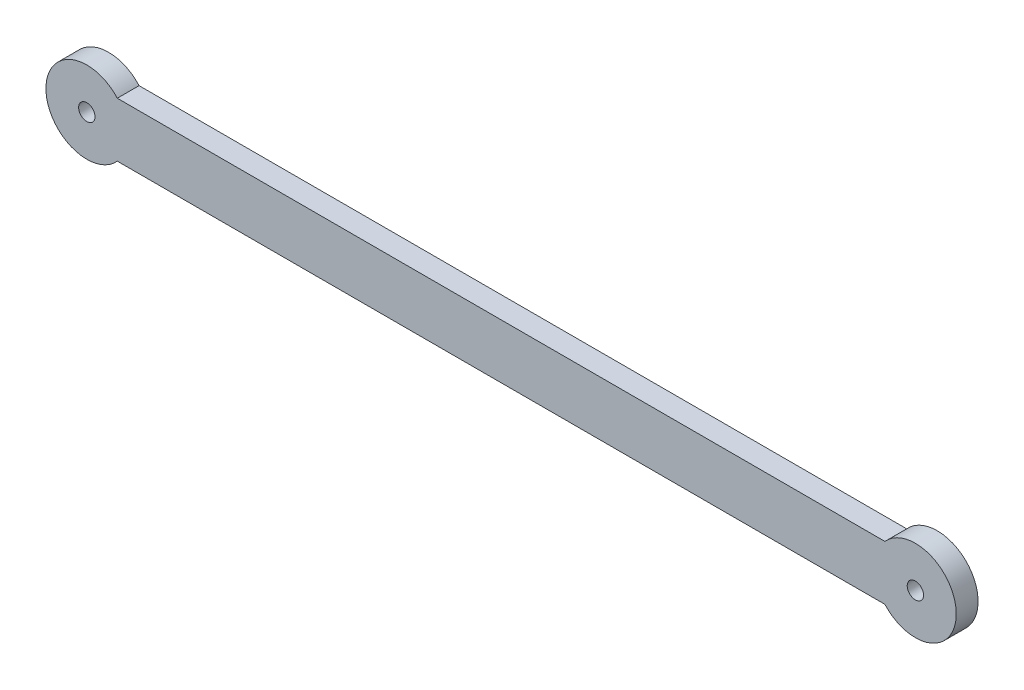
ISO-10303-21;
HEADER;
FILE_DESCRIPTION(('STEP AP214'),'2;1');
FILE_NAME('part.step','',(''),(''),'','','');
FILE_SCHEMA(('AUTOMOTIVE_DESIGN { 1 0 10303 214 1 1 1 1 }'));
ENDSEC;
DATA;
#1=APPLICATION_CONTEXT('core data for automotive mechanical design processes');
#2=APPLICATION_PROTOCOL_DEFINITION('international standard','automotive_design',2000,#1);
#3=PRODUCT_CONTEXT('',#1,'mechanical');
#4=PRODUCT('Part','Part','',(#3));
#5=PRODUCT_RELATED_PRODUCT_CATEGORY('part','',(#4));
#6=PRODUCT_DEFINITION_FORMATION('','',#4);
#7=PRODUCT_DEFINITION_CONTEXT('part definition',#1,'design');
#8=PRODUCT_DEFINITION('design','',#6,#7);
#9=PRODUCT_DEFINITION_SHAPE('','',#8);
#10=(LENGTH_UNIT() NAMED_UNIT(*) SI_UNIT(.MILLI.,.METRE.));
#11=(NAMED_UNIT(*) PLANE_ANGLE_UNIT() SI_UNIT($,.RADIAN.));
#12=(NAMED_UNIT(*) SI_UNIT($,.STERADIAN.) SOLID_ANGLE_UNIT());
#13=UNCERTAINTY_MEASURE_WITH_UNIT(LENGTH_MEASURE(1.E-05),#10,'distance_accuracy_value','');
#14=(GEOMETRIC_REPRESENTATION_CONTEXT(3) GLOBAL_UNCERTAINTY_ASSIGNED_CONTEXT((#13)) GLOBAL_UNIT_ASSIGNED_CONTEXT((#10,
#11,#12)) REPRESENTATION_CONTEXT('',''));
#15=CARTESIAN_POINT('',(0.,0.,0.));
#16=DIRECTION('',(0.,0.,1.));
#17=DIRECTION('',(1.,0.,0.));
#18=AXIS2_PLACEMENT_3D('',#15,#16,#17);
#19=CARTESIAN_POINT('',(0.,0.,4.));
#20=DIRECTION('',(0.,0.,1.));
#21=DIRECTION('',(1.,0.,0.));
#22=AXIS2_PLACEMENT_3D('',#19,#20,#21);
#23=PLANE('',#22);
#24=CARTESIAN_POINT('',(0.,0.,4.));
#25=DIRECTION('',(0.,0.,1.));
#26=DIRECTION('',(1.,0.,0.));
#27=AXIS2_PLACEMENT_3D('',#24,#25,#26);
#28=CIRCLE('',#27,1.5);
#29=CARTESIAN_POINT('',(1.5,0.,4.));
#30=VERTEX_POINT('',#29);
#31=EDGE_CURVE('E108',#30,#30,#28,.T.);
#32=ORIENTED_EDGE('',*,*,#31,.F.);
#33=EDGE_LOOP('',(#32));
#34=FACE_BOUND('',#33,.T.);
#35=CARTESIAN_POINT('',(0.,0.,4.));
#36=DIRECTION('',(0.,0.,1.));
#37=DIRECTION('',(1.,0.,0.));
#38=AXIS2_PLACEMENT_3D('',#35,#36,#37);
#39=CIRCLE('',#38,7.5);
#40=CARTESIAN_POINT('',(5.59016994374947,5.,4.));
#41=VERTEX_POINT('',#40);
#42=CARTESIAN_POINT('',(5.59016994374947,-5.,4.));
#43=VERTEX_POINT('',#42);
#44=EDGE_CURVE('E93',#41,#43,#39,.T.);
#45=ORIENTED_EDGE('',*,*,#44,.T.);
#46=DIRECTION('',(1.,0.,0.));
#47=VECTOR('',#46,1.);
#48=CARTESIAN_POINT('',(5.59016994374947,-5.,4.));
#49=LINE('',#48,#47);
#50=CARTESIAN_POINT('',(146.409830056251,-5.,4.));
#51=VERTEX_POINT('',#50);
#52=EDGE_CURVE('E88',#43,#51,#49,.T.);
#53=ORIENTED_EDGE('',*,*,#52,.T.);
#54=CARTESIAN_POINT('',(152.,0.,4.));
#55=DIRECTION('',(0.,0.,1.));
#56=DIRECTION('',(1.,0.,0.));
#57=AXIS2_PLACEMENT_3D('',#54,#55,#56);
#58=CIRCLE('',#57,7.5);
#59=CARTESIAN_POINT('',(146.409830056251,5.,4.));
#60=VERTEX_POINT('',#59);
#61=EDGE_CURVE('E91',#51,#60,#58,.T.);
#62=ORIENTED_EDGE('',*,*,#61,.T.);
#63=DIRECTION('',(-1.,0.,0.));
#64=VECTOR('',#63,1.);
#65=CARTESIAN_POINT('',(5.59016994374947,5.,4.));
#66=LINE('',#65,#64);
#67=EDGE_CURVE('E58',#60,#41,#66,.T.);
#68=ORIENTED_EDGE('',*,*,#67,.T.);
#69=EDGE_LOOP('',(#45,#53,#62,#68));
#70=FACE_BOUND('',#69,.T.);
#71=CARTESIAN_POINT('',(152.,0.,4.));
#72=DIRECTION('',(0.,0.,1.));
#73=DIRECTION('',(1.,0.,0.));
#74=AXIS2_PLACEMENT_3D('',#71,#72,#73);
#75=CIRCLE('',#74,1.5);
#76=CARTESIAN_POINT('',(153.5,0.,4.));
#77=VERTEX_POINT('',#76);
#78=EDGE_CURVE('E123',#77,#77,#75,.T.);
#79=ORIENTED_EDGE('',*,*,#78,.F.);
#80=EDGE_LOOP('',(#79));
#81=FACE_BOUND('',#80,.T.);
#82=ADVANCED_FACE('F41',(#34,#70,#81),#23,.T.);
#83=CARTESIAN_POINT('',(0.,0.,0.));
#84=DIRECTION('',(0.,0.,1.));
#85=DIRECTION('',(1.,0.,0.));
#86=AXIS2_PLACEMENT_3D('',#83,#84,#85);
#87=PLANE('',#86);
#88=CARTESIAN_POINT('',(0.,0.,0.));
#89=DIRECTION('',(0.,0.,1.));
#90=DIRECTION('',(1.,0.,0.));
#91=AXIS2_PLACEMENT_3D('',#88,#89,#90);
#92=CIRCLE('',#91,1.5);
#93=CARTESIAN_POINT('',(1.5,0.,0.));
#94=VERTEX_POINT('',#93);
#95=EDGE_CURVE('E120',#94,#94,#92,.T.);
#96=ORIENTED_EDGE('',*,*,#95,.T.);
#97=EDGE_LOOP('',(#96));
#98=FACE_BOUND('',#97,.T.);
#99=CARTESIAN_POINT('',(0.,0.,0.));
#100=DIRECTION('',(0.,0.,1.));
#101=DIRECTION('',(1.,0.,0.));
#102=AXIS2_PLACEMENT_3D('',#99,#100,#101);
#103=CIRCLE('',#102,7.5);
#104=CARTESIAN_POINT('',(5.59016994374947,5.,0.));
#105=VERTEX_POINT('',#104);
#106=CARTESIAN_POINT('',(5.59016994374947,-5.,0.));
#107=VERTEX_POINT('',#106);
#108=EDGE_CURVE('E105',#105,#107,#103,.T.);
#109=ORIENTED_EDGE('',*,*,#108,.F.);
#110=DIRECTION('',(-1.,0.,0.));
#111=VECTOR('',#110,1.);
#112=CARTESIAN_POINT('',(5.59016994374947,5.,0.));
#113=LINE('',#112,#111);
#114=CARTESIAN_POINT('',(146.409830056251,5.,0.));
#115=VERTEX_POINT('',#114);
#116=EDGE_CURVE('E81',#115,#105,#113,.T.);
#117=ORIENTED_EDGE('',*,*,#116,.F.);
#118=CARTESIAN_POINT('',(152.,0.,0.));
#119=DIRECTION('',(0.,0.,1.));
#120=DIRECTION('',(1.,0.,0.));
#121=AXIS2_PLACEMENT_3D('',#118,#119,#120);
#122=CIRCLE('',#121,7.5);
#123=CARTESIAN_POINT('',(146.409830056251,-5.,0.));
#124=VERTEX_POINT('',#123);
#125=EDGE_CURVE('E75',#124,#115,#122,.T.);
#126=ORIENTED_EDGE('',*,*,#125,.F.);
#127=DIRECTION('',(1.,0.,0.));
#128=VECTOR('',#127,1.);
#129=CARTESIAN_POINT('',(5.59016994374947,-5.,0.));
#130=LINE('',#129,#128);
#131=EDGE_CURVE('E97',#107,#124,#130,.T.);
#132=ORIENTED_EDGE('',*,*,#131,.F.);
#133=EDGE_LOOP('',(#109,#117,#126,#132));
#134=FACE_BOUND('',#133,.T.);
#135=CARTESIAN_POINT('',(152.,0.,0.));
#136=DIRECTION('',(0.,0.,1.));
#137=DIRECTION('',(1.,0.,0.));
#138=AXIS2_PLACEMENT_3D('',#135,#136,#137);
#139=CIRCLE('',#138,1.5);
#140=CARTESIAN_POINT('',(153.5,0.,0.));
#141=VERTEX_POINT('',#140);
#142=EDGE_CURVE('E126',#141,#141,#139,.T.);
#143=ORIENTED_EDGE('',*,*,#142,.T.);
#144=EDGE_LOOP('',(#143));
#145=FACE_BOUND('',#144,.T.);
#146=ADVANCED_FACE('F116',(#98,#134,#145),#87,.F.);
#147=CARTESIAN_POINT('',(0.,0.,4.));
#148=DIRECTION('',(0.,0.,-1.));
#149=DIRECTION('',(-1.,0.,0.));
#150=AXIS2_PLACEMENT_3D('',#147,#148,#149);
#151=CYLINDRICAL_SURFACE('',#150,7.5);
#152=ORIENTED_EDGE('',*,*,#108,.T.);
#153=DIRECTION('',(0.,0.,-1.));
#154=VECTOR('',#153,1.);
#155=CARTESIAN_POINT('',(5.59016994374947,-5.,4.));
#156=LINE('',#155,#154);
#157=EDGE_CURVE('E13',#43,#107,#156,.T.);
#158=ORIENTED_EDGE('',*,*,#157,.F.);
#159=ORIENTED_EDGE('',*,*,#44,.F.);
#160=DIRECTION('',(0.,0.,-1.));
#161=VECTOR('',#160,1.);
#162=CARTESIAN_POINT('',(5.59016994374947,5.,4.));
#163=LINE('',#162,#161);
#164=EDGE_CURVE('E101',#41,#105,#163,.T.);
#165=ORIENTED_EDGE('',*,*,#164,.T.);
#166=EDGE_LOOP('',(#152,#158,#159,#165));
#167=FACE_BOUND('',#166,.T.);
#168=ADVANCED_FACE('F43',(#167),#151,.T.);
#169=CARTESIAN_POINT('',(5.59016994374947,-5.,4.));
#170=DIRECTION('',(0.,1.,0.));
#171=DIRECTION('',(0.,0.,1.));
#172=AXIS2_PLACEMENT_3D('',#169,#170,#171);
#173=PLANE('',#172);
#174=ORIENTED_EDGE('',*,*,#131,.T.);
#175=DIRECTION('',(0.,0.,-1.));
#176=VECTOR('',#175,1.);
#177=CARTESIAN_POINT('',(146.409830056251,-5.,4.));
#178=LINE('',#177,#176);
#179=EDGE_CURVE('E50',#51,#124,#178,.T.);
#180=ORIENTED_EDGE('',*,*,#179,.F.);
#181=ORIENTED_EDGE('',*,*,#52,.F.);
#182=ORIENTED_EDGE('',*,*,#157,.T.);
#183=EDGE_LOOP('',(#174,#180,#181,#182));
#184=FACE_BOUND('',#183,.T.);
#185=ADVANCED_FACE('F96',(#184),#173,.F.);
#186=CARTESIAN_POINT('',(152.,0.,4.));
#187=DIRECTION('',(0.,0.,-1.));
#188=DIRECTION('',(-1.,0.,0.));
#189=AXIS2_PLACEMENT_3D('',#186,#187,#188);
#190=CYLINDRICAL_SURFACE('',#189,7.5);
#191=ORIENTED_EDGE('',*,*,#125,.T.);
#192=DIRECTION('',(0.,0.,-1.));
#193=VECTOR('',#192,1.);
#194=CARTESIAN_POINT('',(146.409830056251,5.,4.));
#195=LINE('',#194,#193);
#196=EDGE_CURVE('E98',#60,#115,#195,.T.);
#197=ORIENTED_EDGE('',*,*,#196,.F.);
#198=ORIENTED_EDGE('',*,*,#61,.F.);
#199=ORIENTED_EDGE('',*,*,#179,.T.);
#200=EDGE_LOOP('',(#191,#197,#198,#199));
#201=FACE_BOUND('',#200,.T.);
#202=ADVANCED_FACE('F99',(#201),#190,.T.);
#203=CARTESIAN_POINT('',(5.59016994374947,5.,4.));
#204=DIRECTION('',(0.,-1.,0.));
#205=DIRECTION('',(0.,0.,-1.));
#206=AXIS2_PLACEMENT_3D('',#203,#204,#205);
#207=PLANE('',#206);
#208=ORIENTED_EDGE('',*,*,#116,.T.);
#209=ORIENTED_EDGE('',*,*,#164,.F.);
#210=ORIENTED_EDGE('',*,*,#67,.F.);
#211=ORIENTED_EDGE('',*,*,#196,.T.);
#212=EDGE_LOOP('',(#208,#209,#210,#211));
#213=FACE_BOUND('',#212,.T.);
#214=ADVANCED_FACE('F113',(#213),#207,.F.);
#215=CARTESIAN_POINT('',(0.,0.,4.));
#216=DIRECTION('',(0.,0.,-1.));
#217=DIRECTION('',(-1.,0.,0.));
#218=AXIS2_PLACEMENT_3D('',#215,#216,#217);
#219=CYLINDRICAL_SURFACE('',#218,1.5);
#220=ORIENTED_EDGE('',*,*,#31,.T.);
#221=EDGE_LOOP('',(#220));
#222=FACE_BOUND('',#221,.T.);
#223=ORIENTED_EDGE('',*,*,#95,.F.);
#224=EDGE_LOOP('',(#223));
#225=FACE_BOUND('',#224,.T.);
#226=ADVANCED_FACE('F144',(#222,#225),#219,.F.);
#227=CARTESIAN_POINT('',(152.,0.,4.));
#228=DIRECTION('',(0.,0.,-1.));
#229=DIRECTION('',(-1.,0.,0.));
#230=AXIS2_PLACEMENT_3D('',#227,#228,#229);
#231=CYLINDRICAL_SURFACE('',#230,1.5);
#232=ORIENTED_EDGE('',*,*,#78,.T.);
#233=EDGE_LOOP('',(#232));
#234=FACE_BOUND('',#233,.T.);
#235=ORIENTED_EDGE('',*,*,#142,.F.);
#236=EDGE_LOOP('',(#235));
#237=FACE_BOUND('',#236,.T.);
#238=ADVANCED_FACE('F132',(#234,#237),#231,.F.);
#239=CLOSED_SHELL('',(#82,#146,#168,#185,#202,#214,#226,#238));
#240=MANIFOLD_SOLID_BREP('B2',#239);
#241=ADVANCED_BREP_SHAPE_REPRESENTATION('',(#18,#240),#14);
#242=SHAPE_DEFINITION_REPRESENTATION(#9,#241);
ENDSEC;
END-ISO-10303-21;
